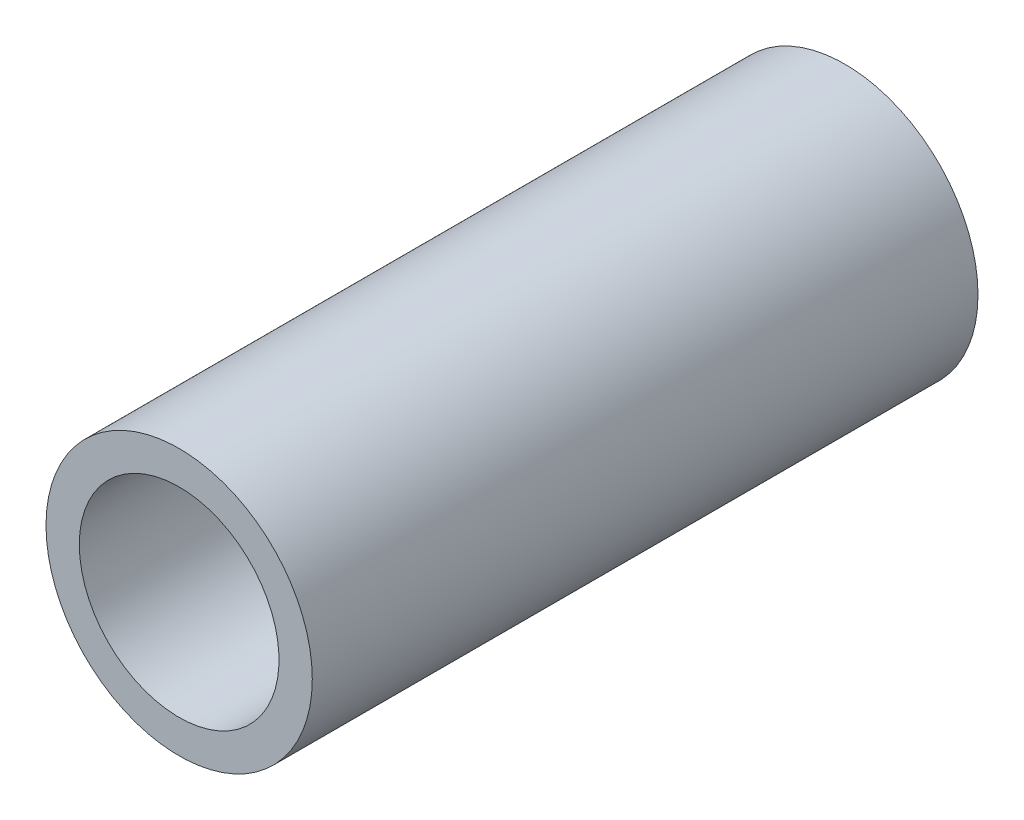
ISO-10303-21;
HEADER;
FILE_DESCRIPTION(('STEP AP214'),'2;1');
FILE_NAME('part.step','',(''),(''),'','','');
FILE_SCHEMA(('AUTOMOTIVE_DESIGN { 1 0 10303 214 1 1 1 1 }'));
ENDSEC;
DATA;
#1=APPLICATION_CONTEXT('core data for automotive mechanical design processes');
#2=APPLICATION_PROTOCOL_DEFINITION('international standard','automotive_design',2000,#1);
#3=PRODUCT_CONTEXT('',#1,'mechanical');
#4=PRODUCT('Part','Part','',(#3));
#5=PRODUCT_RELATED_PRODUCT_CATEGORY('part','',(#4));
#6=PRODUCT_DEFINITION_FORMATION('','',#4);
#7=PRODUCT_DEFINITION_CONTEXT('part definition',#1,'design');
#8=PRODUCT_DEFINITION('design','',#6,#7);
#9=PRODUCT_DEFINITION_SHAPE('','',#8);
#10=(LENGTH_UNIT() NAMED_UNIT(*) SI_UNIT(.MILLI.,.METRE.));
#11=(NAMED_UNIT(*) PLANE_ANGLE_UNIT() SI_UNIT($,.RADIAN.));
#12=(NAMED_UNIT(*) SI_UNIT($,.STERADIAN.) SOLID_ANGLE_UNIT());
#13=UNCERTAINTY_MEASURE_WITH_UNIT(LENGTH_MEASURE(1.E-05),#10,'distance_accuracy_value','');
#14=(GEOMETRIC_REPRESENTATION_CONTEXT(3) GLOBAL_UNCERTAINTY_ASSIGNED_CONTEXT((#13)) GLOBAL_UNIT_ASSIGNED_CONTEXT((#10,
#11,#12)) REPRESENTATION_CONTEXT('',''));
#15=CARTESIAN_POINT('',(0.,0.,0.));
#16=DIRECTION('',(0.,0.,1.));
#17=DIRECTION('',(1.,0.,0.));
#18=AXIS2_PLACEMENT_3D('',#15,#16,#17);
#19=CARTESIAN_POINT('',(0.,0.,60.));
#20=DIRECTION('',(0.,0.,1.));
#21=DIRECTION('',(1.,0.,0.));
#22=AXIS2_PLACEMENT_3D('',#19,#20,#21);
#23=PLANE('',#22);
#24=CARTESIAN_POINT('',(0.,0.,60.));
#25=DIRECTION('',(0.,0.,1.));
#26=DIRECTION('',(1.,0.,0.));
#27=AXIS2_PLACEMENT_3D('',#24,#25,#26);
#28=CIRCLE('',#27,12.);
#29=CARTESIAN_POINT('',(-12.,0.,60.));
#30=VERTEX_POINT('',#29);
#31=EDGE_CURVE('E10',#30,#30,#28,.T.);
#32=ORIENTED_EDGE('',*,*,#31,.T.);
#33=EDGE_LOOP('',(#32));
#34=FACE_BOUND('',#33,.T.);
#35=CARTESIAN_POINT('',(0.,0.,60.));
#36=DIRECTION('',(0.,0.,1.));
#37=DIRECTION('',(1.,0.,0.));
#38=AXIS2_PLACEMENT_3D('',#35,#36,#37);
#39=CIRCLE('',#38,9.);
#40=CARTESIAN_POINT('',(-9.,0.,60.));
#41=VERTEX_POINT('',#40);
#42=EDGE_CURVE('E50',#41,#41,#39,.T.);
#43=ORIENTED_EDGE('',*,*,#42,.F.);
#44=EDGE_LOOP('',(#43));
#45=FACE_BOUND('',#44,.T.);
#46=ADVANCED_FACE('F37',(#34,#45),#23,.T.);
#47=CARTESIAN_POINT('',(0.,0.,0.));
#48=DIRECTION('',(0.,0.,1.));
#49=DIRECTION('',(1.,0.,0.));
#50=AXIS2_PLACEMENT_3D('',#47,#48,#49);
#51=PLANE('',#50);
#52=CARTESIAN_POINT('',(0.,0.,0.));
#53=DIRECTION('',(0.,0.,1.));
#54=DIRECTION('',(1.,0.,0.));
#55=AXIS2_PLACEMENT_3D('',#52,#53,#54);
#56=CIRCLE('',#55,12.);
#57=CARTESIAN_POINT('',(-12.,0.,0.));
#58=VERTEX_POINT('',#57);
#59=EDGE_CURVE('E41',#58,#58,#56,.T.);
#60=ORIENTED_EDGE('',*,*,#59,.F.);
#61=EDGE_LOOP('',(#60));
#62=FACE_BOUND('',#61,.T.);
#63=CARTESIAN_POINT('',(0.,0.,0.));
#64=DIRECTION('',(0.,0.,1.));
#65=DIRECTION('',(1.,0.,0.));
#66=AXIS2_PLACEMENT_3D('',#63,#64,#65);
#67=CIRCLE('',#66,9.);
#68=CARTESIAN_POINT('',(-9.,0.,0.));
#69=VERTEX_POINT('',#68);
#70=EDGE_CURVE('E52',#69,#69,#67,.T.);
#71=ORIENTED_EDGE('',*,*,#70,.T.);
#72=EDGE_LOOP('',(#71));
#73=FACE_BOUND('',#72,.T.);
#74=ADVANCED_FACE('F64',(#62,#73),#51,.F.);
#75=CARTESIAN_POINT('',(0.,0.,60.));
#76=DIRECTION('',(0.,0.,-1.));
#77=DIRECTION('',(-1.,0.,0.));
#78=AXIS2_PLACEMENT_3D('',#75,#76,#77);
#79=CYLINDRICAL_SURFACE('',#78,12.);
#80=CARTESIAN_POINT('',(-12.,0.,60.));
#81=CARTESIAN_POINT('',(-12.,0.,59.375));
#82=CARTESIAN_POINT('',(-12.,0.,58.75));
#83=CARTESIAN_POINT('',(-12.,0.,57.5));
#84=CARTESIAN_POINT('',(-12.,0.,56.875));
#85=CARTESIAN_POINT('',(-12.,0.,55.625));
#86=CARTESIAN_POINT('',(-12.,0.,55.));
#87=CARTESIAN_POINT('',(-12.,0.,53.75));
#88=CARTESIAN_POINT('',(-12.,0.,53.125));
#89=CARTESIAN_POINT('',(-12.,0.,51.875));
#90=CARTESIAN_POINT('',(-12.,0.,51.25));
#91=CARTESIAN_POINT('',(-12.,0.,50.));
#92=CARTESIAN_POINT('',(-12.,0.,49.375));
#93=CARTESIAN_POINT('',(-12.,0.,48.125));
#94=CARTESIAN_POINT('',(-12.,0.,47.5));
#95=CARTESIAN_POINT('',(-12.,0.,46.25));
#96=CARTESIAN_POINT('',(-12.,0.,45.625));
#97=CARTESIAN_POINT('',(-12.,0.,44.375));
#98=CARTESIAN_POINT('',(-12.,0.,43.75));
#99=CARTESIAN_POINT('',(-12.,0.,42.5));
#100=CARTESIAN_POINT('',(-12.,0.,41.875));
#101=CARTESIAN_POINT('',(-12.,0.,40.625));
#102=CARTESIAN_POINT('',(-12.,0.,40.));
#103=CARTESIAN_POINT('',(-12.,0.,38.75));
#104=CARTESIAN_POINT('',(-12.,0.,38.125));
#105=CARTESIAN_POINT('',(-12.,0.,36.875));
#106=CARTESIAN_POINT('',(-12.,0.,36.25));
#107=CARTESIAN_POINT('',(-12.,0.,35.));
#108=CARTESIAN_POINT('',(-12.,0.,34.375));
#109=CARTESIAN_POINT('',(-12.,0.,33.125));
#110=CARTESIAN_POINT('',(-12.,0.,32.5));
#111=CARTESIAN_POINT('',(-12.,0.,31.25));
#112=CARTESIAN_POINT('',(-12.,0.,30.625));
#113=CARTESIAN_POINT('',(-12.,0.,29.375));
#114=CARTESIAN_POINT('',(-12.,0.,28.75));
#115=CARTESIAN_POINT('',(-12.,0.,27.5));
#116=CARTESIAN_POINT('',(-12.,0.,26.875));
#117=CARTESIAN_POINT('',(-12.,0.,25.625));
#118=CARTESIAN_POINT('',(-12.,0.,25.));
#119=CARTESIAN_POINT('',(-12.,0.,23.75));
#120=CARTESIAN_POINT('',(-12.,0.,23.125));
#121=CARTESIAN_POINT('',(-12.,0.,21.875));
#122=CARTESIAN_POINT('',(-12.,0.,21.25));
#123=CARTESIAN_POINT('',(-12.,0.,20.));
#124=CARTESIAN_POINT('',(-12.,0.,19.375));
#125=CARTESIAN_POINT('',(-12.,0.,18.125));
#126=CARTESIAN_POINT('',(-12.,0.,17.5));
#127=CARTESIAN_POINT('',(-12.,0.,16.25));
#128=CARTESIAN_POINT('',(-12.,0.,15.625));
#129=CARTESIAN_POINT('',(-12.,0.,14.375));
#130=CARTESIAN_POINT('',(-12.,0.,13.75));
#131=CARTESIAN_POINT('',(-12.,0.,12.5));
#132=CARTESIAN_POINT('',(-12.,0.,11.875));
#133=CARTESIAN_POINT('',(-12.,0.,10.625));
#134=CARTESIAN_POINT('',(-12.,0.,10.));
#135=CARTESIAN_POINT('',(-12.,0.,8.75));
#136=CARTESIAN_POINT('',(-12.,0.,8.125));
#137=CARTESIAN_POINT('',(-12.,0.,6.875));
#138=CARTESIAN_POINT('',(-12.,0.,6.25));
#139=CARTESIAN_POINT('',(-12.,0.,5.));
#140=CARTESIAN_POINT('',(-12.,0.,4.375));
#141=CARTESIAN_POINT('',(-12.,0.,3.125));
#142=CARTESIAN_POINT('',(-12.,0.,2.5));
#143=CARTESIAN_POINT('',(-12.,0.,1.25));
#144=CARTESIAN_POINT('',(-12.,0.,0.625000000000001));
#145=CARTESIAN_POINT('',(-12.,0.,0.));
#146=B_SPLINE_CURVE_WITH_KNOTS('',3,(#80,#81,#82,#83,#84,#85,#86,#87,#88,#89,#90,#91,#92,#93,
#94,#95,#96,#97,#98,#99,#100,#101,#102,#103,#104,#105,#106,#107,#108,#109,#110,#111,#112,#113,
#114,#115,#116,#117,#118,#119,#120,#121,#122,#123,#124,#125,#126,#127,#128,#129,#130,#131,#132,
#133,#134,#135,#136,#137,#138,#139,#140,#141,#142,#143,#144,#145),.UNSPECIFIED.,.F.,.F.,(4,2,2,
2,2,2,2,2,2,2,2,2,2,2,2,2,2,2,2,2,2,2,2,2,2,2,2,2,2,2,2,2,4),(0.,1.875,3.75,5.62500000000001,
7.50000000000001,9.375,11.25,13.125,15.,16.875,18.75,20.625,22.5,24.375,26.25,28.125,30.,31.875,
33.75,35.625,37.5,39.375,41.25,43.125,45.,46.875,48.75,50.625,52.5,54.375,56.25,58.125,60.),.UNSPECIFIED.);
#147=EDGE_CURVE('BSEAM39',#30,#58,#146,.T.);
#148=ORIENTED_EDGE('',*,*,#31,.F.);
#149=ORIENTED_EDGE('',*,*,#59,.T.);
#150=ORIENTED_EDGE('',*,*,#147,.T.);
#151=ORIENTED_EDGE('',*,*,#147,.F.);
#152=EDGE_LOOP('',(#148,#150,#149,#151));
#153=FACE_BOUND('',#152,.T.);
#154=ADVANCED_FACE('F39',(#153),#79,.T.);
#155=CARTESIAN_POINT('',(0.,0.,60.));
#156=DIRECTION('',(0.,0.,-1.));
#157=DIRECTION('',(-1.,0.,0.));
#158=AXIS2_PLACEMENT_3D('',#155,#156,#157);
#159=CYLINDRICAL_SURFACE('',#158,9.);
#160=CARTESIAN_POINT('',(-9.,0.,60.));
#161=CARTESIAN_POINT('',(-9.,0.,59.375));
#162=CARTESIAN_POINT('',(-9.,0.,58.75));
#163=CARTESIAN_POINT('',(-9.,0.,57.5));
#164=CARTESIAN_POINT('',(-9.,0.,56.875));
#165=CARTESIAN_POINT('',(-9.,0.,55.625));
#166=CARTESIAN_POINT('',(-9.,0.,55.));
#167=CARTESIAN_POINT('',(-9.,0.,53.75));
#168=CARTESIAN_POINT('',(-9.,0.,53.125));
#169=CARTESIAN_POINT('',(-9.,0.,51.875));
#170=CARTESIAN_POINT('',(-9.,0.,51.25));
#171=CARTESIAN_POINT('',(-9.,0.,50.));
#172=CARTESIAN_POINT('',(-9.,0.,49.375));
#173=CARTESIAN_POINT('',(-9.,0.,48.125));
#174=CARTESIAN_POINT('',(-9.,0.,47.5));
#175=CARTESIAN_POINT('',(-9.,0.,46.25));
#176=CARTESIAN_POINT('',(-9.,0.,45.625));
#177=CARTESIAN_POINT('',(-9.,0.,44.375));
#178=CARTESIAN_POINT('',(-9.,0.,43.75));
#179=CARTESIAN_POINT('',(-9.,0.,42.5));
#180=CARTESIAN_POINT('',(-9.,0.,41.875));
#181=CARTESIAN_POINT('',(-9.,0.,40.625));
#182=CARTESIAN_POINT('',(-9.,0.,40.));
#183=CARTESIAN_POINT('',(-9.,0.,38.75));
#184=CARTESIAN_POINT('',(-9.,0.,38.125));
#185=CARTESIAN_POINT('',(-9.,0.,36.875));
#186=CARTESIAN_POINT('',(-9.,0.,36.25));
#187=CARTESIAN_POINT('',(-9.,0.,35.));
#188=CARTESIAN_POINT('',(-9.,0.,34.375));
#189=CARTESIAN_POINT('',(-9.,0.,33.125));
#190=CARTESIAN_POINT('',(-9.,0.,32.5));
#191=CARTESIAN_POINT('',(-9.,0.,31.25));
#192=CARTESIAN_POINT('',(-9.,0.,30.625));
#193=CARTESIAN_POINT('',(-9.,0.,29.375));
#194=CARTESIAN_POINT('',(-9.,0.,28.75));
#195=CARTESIAN_POINT('',(-9.,0.,27.5));
#196=CARTESIAN_POINT('',(-9.,0.,26.875));
#197=CARTESIAN_POINT('',(-9.,0.,25.625));
#198=CARTESIAN_POINT('',(-9.,0.,25.));
#199=CARTESIAN_POINT('',(-9.,0.,23.75));
#200=CARTESIAN_POINT('',(-9.,0.,23.125));
#201=CARTESIAN_POINT('',(-9.,0.,21.875));
#202=CARTESIAN_POINT('',(-9.,0.,21.25));
#203=CARTESIAN_POINT('',(-9.,0.,20.));
#204=CARTESIAN_POINT('',(-9.,0.,19.375));
#205=CARTESIAN_POINT('',(-9.,0.,18.125));
#206=CARTESIAN_POINT('',(-9.,0.,17.5));
#207=CARTESIAN_POINT('',(-9.,0.,16.25));
#208=CARTESIAN_POINT('',(-9.,0.,15.625));
#209=CARTESIAN_POINT('',(-9.,0.,14.375));
#210=CARTESIAN_POINT('',(-9.,0.,13.75));
#211=CARTESIAN_POINT('',(-9.,0.,12.5));
#212=CARTESIAN_POINT('',(-9.,0.,11.875));
#213=CARTESIAN_POINT('',(-9.,0.,10.625));
#214=CARTESIAN_POINT('',(-9.,0.,10.));
#215=CARTESIAN_POINT('',(-9.,0.,8.75));
#216=CARTESIAN_POINT('',(-9.,0.,8.125));
#217=CARTESIAN_POINT('',(-9.,0.,6.875));
#218=CARTESIAN_POINT('',(-9.,0.,6.25));
#219=CARTESIAN_POINT('',(-9.,0.,5.));
#220=CARTESIAN_POINT('',(-9.,0.,4.375));
#221=CARTESIAN_POINT('',(-9.,0.,3.125));
#222=CARTESIAN_POINT('',(-9.,0.,2.5));
#223=CARTESIAN_POINT('',(-9.,0.,1.25));
#224=CARTESIAN_POINT('',(-9.,0.,0.625000000000001));
#225=CARTESIAN_POINT('',(-9.,0.,0.));
#226=B_SPLINE_CURVE_WITH_KNOTS('',3,(#160,#161,#162,#163,#164,#165,#166,#167,#168,#169,#170,
#171,#172,#173,#174,#175,#176,#177,#178,#179,#180,#181,#182,#183,#184,#185,#186,#187,#188,#189,
#190,#191,#192,#193,#194,#195,#196,#197,#198,#199,#200,#201,#202,#203,#204,#205,#206,#207,#208,
#209,#210,#211,#212,#213,#214,#215,#216,#217,#218,#219,#220,#221,#222,#223,#224,#225),
.UNSPECIFIED.,.F.,.F.,(4,2,2,2,2,2,2,2,2,2,2,2,2,2,2,2,2,2,2,2,2,2,2,2,2,2,2,2,2,2,2,2,4),(0.,
1.875,3.75,5.62500000000001,7.50000000000001,9.375,11.25,13.125,15.,16.875,18.75,20.625,22.5,
24.375,26.25,28.125,30.,31.875,33.75,35.625,37.5,39.375,41.25,43.125,45.,46.875,48.75,50.625,
52.5,54.375,56.25,58.125,60.),.UNSPECIFIED.);
#227=EDGE_CURVE('BSEAM60',#41,#69,#226,.T.);
#228=ORIENTED_EDGE('',*,*,#42,.T.);
#229=ORIENTED_EDGE('',*,*,#70,.F.);
#230=ORIENTED_EDGE('',*,*,#227,.T.);
#231=ORIENTED_EDGE('',*,*,#227,.F.);
#232=EDGE_LOOP('',(#228,#230,#229,#231));
#233=FACE_BOUND('',#232,.T.);
#234=ADVANCED_FACE('F60',(#233),#159,.F.);
#235=CLOSED_SHELL('',(#46,#74,#154,#234));
#236=MANIFOLD_SOLID_BREP('B2',#235);
#237=ADVANCED_BREP_SHAPE_REPRESENTATION('',(#18,#236),#14);
#238=SHAPE_DEFINITION_REPRESENTATION(#9,#237);
ENDSEC;
END-ISO-10303-21;
